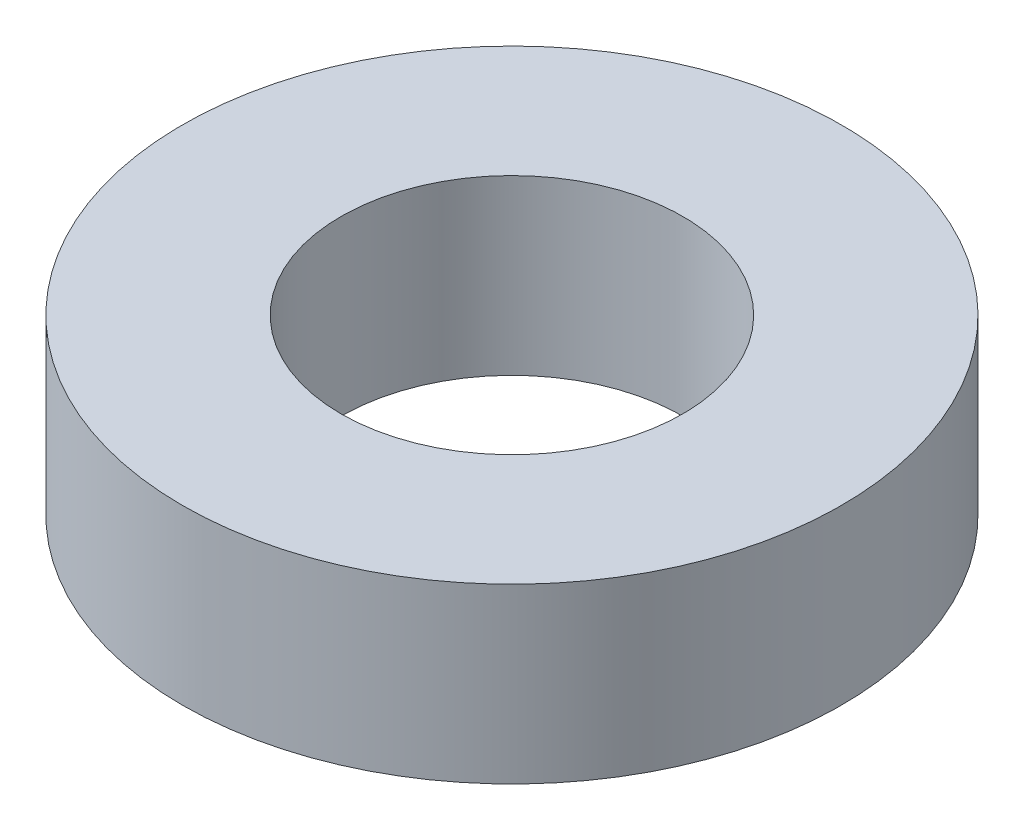
ISO-10303-21;
HEADER;
FILE_DESCRIPTION(('STEP AP214'),'2;1');
FILE_NAME('part.step','',(''),(''),'','','');
FILE_SCHEMA(('AUTOMOTIVE_DESIGN { 1 0 10303 214 1 1 1 1 }'));
ENDSEC;
DATA;
#1=APPLICATION_CONTEXT('core data for automotive mechanical design processes');
#2=APPLICATION_PROTOCOL_DEFINITION('international standard','automotive_design',2000,#1);
#3=PRODUCT_CONTEXT('',#1,'mechanical');
#4=PRODUCT('Part','Part','',(#3));
#5=PRODUCT_RELATED_PRODUCT_CATEGORY('part','',(#4));
#6=PRODUCT_DEFINITION_FORMATION('','',#4);
#7=PRODUCT_DEFINITION_CONTEXT('part definition',#1,'design');
#8=PRODUCT_DEFINITION('design','',#6,#7);
#9=PRODUCT_DEFINITION_SHAPE('','',#8);
#10=(LENGTH_UNIT() NAMED_UNIT(*) SI_UNIT(.MILLI.,.METRE.));
#11=(NAMED_UNIT(*) PLANE_ANGLE_UNIT() SI_UNIT($,.RADIAN.));
#12=(NAMED_UNIT(*) SI_UNIT($,.STERADIAN.) SOLID_ANGLE_UNIT());
#13=UNCERTAINTY_MEASURE_WITH_UNIT(LENGTH_MEASURE(1.E-05),#10,'distance_accuracy_value','');
#14=(GEOMETRIC_REPRESENTATION_CONTEXT(3) GLOBAL_UNCERTAINTY_ASSIGNED_CONTEXT((#13)) GLOBAL_UNIT_ASSIGNED_CONTEXT((#10,
#11,#12)) REPRESENTATION_CONTEXT('',''));
#15=CARTESIAN_POINT('',(0.,0.,0.));
#16=DIRECTION('',(0.,0.,1.));
#17=DIRECTION('',(1.,0.,0.));
#18=AXIS2_PLACEMENT_3D('',#15,#16,#17);
#19=CARTESIAN_POINT('',(0.,4.2,0.));
#20=DIRECTION('',(0.,1.,0.));
#21=DIRECTION('',(0.,0.,1.));
#22=AXIS2_PLACEMENT_3D('',#19,#20,#21);
#23=PLANE('',#22);
#24=CARTESIAN_POINT('',(0.,4.2,0.));
#25=DIRECTION('',(0.,1.,0.));
#26=DIRECTION('',(0.,0.,1.));
#27=AXIS2_PLACEMENT_3D('',#24,#25,#26);
#28=CIRCLE('',#27,8.);
#29=CARTESIAN_POINT('',(0.,4.2,8.));
#30=VERTEX_POINT('',#29);
#31=EDGE_CURVE('E10',#30,#30,#28,.T.);
#32=ORIENTED_EDGE('',*,*,#31,.T.);
#33=EDGE_LOOP('',(#32));
#34=FACE_BOUND('',#33,.T.);
#35=CARTESIAN_POINT('',(0.,4.2,0.));
#36=DIRECTION('',(0.,1.,0.));
#37=DIRECTION('',(0.,0.,1.));
#38=AXIS2_PLACEMENT_3D('',#35,#36,#37);
#39=CIRCLE('',#38,4.15);
#40=CARTESIAN_POINT('',(0.,4.2,4.15));
#41=VERTEX_POINT('',#40);
#42=EDGE_CURVE('E53',#41,#41,#39,.T.);
#43=ORIENTED_EDGE('',*,*,#42,.F.);
#44=EDGE_LOOP('',(#43));
#45=FACE_BOUND('',#44,.T.);
#46=ADVANCED_FACE('F39',(#34,#45),#23,.T.);
#47=CARTESIAN_POINT('',(0.,0.,0.));
#48=DIRECTION('',(0.,1.,0.));
#49=DIRECTION('',(0.,0.,1.));
#50=AXIS2_PLACEMENT_3D('',#47,#48,#49);
#51=PLANE('',#50);
#52=CARTESIAN_POINT('',(0.,0.,0.));
#53=DIRECTION('',(0.,1.,0.));
#54=DIRECTION('',(0.,0.,1.));
#55=AXIS2_PLACEMENT_3D('',#52,#53,#54);
#56=CIRCLE('',#55,8.);
#57=CARTESIAN_POINT('',(0.,0.,8.));
#58=VERTEX_POINT('',#57);
#59=EDGE_CURVE('E43',#58,#58,#56,.T.);
#60=ORIENTED_EDGE('',*,*,#59,.F.);
#61=EDGE_LOOP('',(#60));
#62=FACE_BOUND('',#61,.T.);
#63=CARTESIAN_POINT('',(0.,0.,0.));
#64=DIRECTION('',(0.,1.,0.));
#65=DIRECTION('',(0.,0.,1.));
#66=AXIS2_PLACEMENT_3D('',#63,#64,#65);
#67=CIRCLE('',#66,4.15);
#68=CARTESIAN_POINT('',(0.,0.,4.15));
#69=VERTEX_POINT('',#68);
#70=EDGE_CURVE('E55',#69,#69,#67,.T.);
#71=ORIENTED_EDGE('',*,*,#70,.T.);
#72=EDGE_LOOP('',(#71));
#73=FACE_BOUND('',#72,.T.);
#74=ADVANCED_FACE('F66',(#62,#73),#51,.F.);
#75=CARTESIAN_POINT('',(0.,4.2,0.));
#76=DIRECTION('',(0.,-1.,0.));
#77=DIRECTION('',(0.,0.,-1.));
#78=AXIS2_PLACEMENT_3D('',#75,#76,#77);
#79=CYLINDRICAL_SURFACE('',#78,8.);
#80=ORIENTED_EDGE('',*,*,#31,.F.);
#81=EDGE_LOOP('',(#80));
#82=FACE_BOUND('',#81,.T.);
#83=ORIENTED_EDGE('',*,*,#59,.T.);
#84=EDGE_LOOP('',(#83));
#85=FACE_BOUND('',#84,.T.);
#86=ADVANCED_FACE('F41',(#82,#85),#79,.T.);
#87=CARTESIAN_POINT('',(0.,4.2,0.));
#88=DIRECTION('',(0.,-1.,0.));
#89=DIRECTION('',(0.,0.,-1.));
#90=AXIS2_PLACEMENT_3D('',#87,#88,#89);
#91=CYLINDRICAL_SURFACE('',#90,4.15);
#92=ORIENTED_EDGE('',*,*,#42,.T.);
#93=EDGE_LOOP('',(#92));
#94=FACE_BOUND('',#93,.T.);
#95=ORIENTED_EDGE('',*,*,#70,.F.);
#96=EDGE_LOOP('',(#95));
#97=FACE_BOUND('',#96,.T.);
#98=ADVANCED_FACE('F62',(#94,#97),#91,.F.);
#99=CLOSED_SHELL('',(#46,#74,#86,#98));
#100=MANIFOLD_SOLID_BREP('B2',#99);
#101=ADVANCED_BREP_SHAPE_REPRESENTATION('',(#18,#100),#14);
#102=SHAPE_DEFINITION_REPRESENTATION(#9,#101);
ENDSEC;
END-ISO-10303-21;
